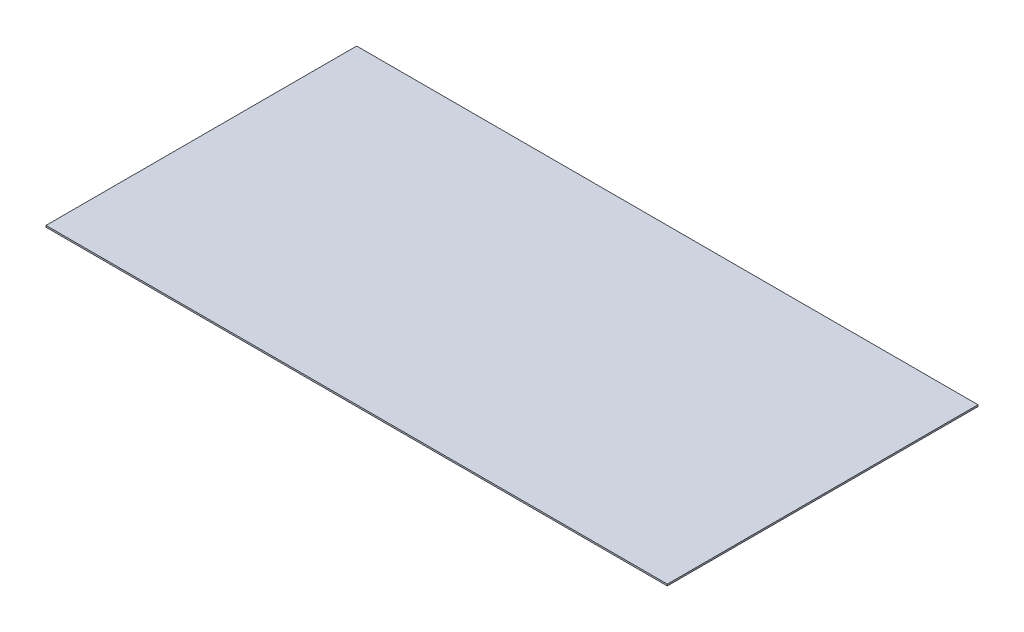
ISO-10303-21;
HEADER;
FILE_DESCRIPTION(('STEP AP214'),'2;1');
FILE_NAME('part.step','',(''),(''),'','','');
FILE_SCHEMA(('AUTOMOTIVE_DESIGN { 1 0 10303 214 1 1 1 1 }'));
ENDSEC;
DATA;
#1=APPLICATION_CONTEXT('core data for automotive mechanical design processes');
#2=APPLICATION_PROTOCOL_DEFINITION('international standard','automotive_design',2000,#1);
#3=PRODUCT_CONTEXT('',#1,'mechanical');
#4=PRODUCT('Part','Part','',(#3));
#5=PRODUCT_RELATED_PRODUCT_CATEGORY('part','',(#4));
#6=PRODUCT_DEFINITION_FORMATION('','',#4);
#7=PRODUCT_DEFINITION_CONTEXT('part definition',#1,'design');
#8=PRODUCT_DEFINITION('design','',#6,#7);
#9=PRODUCT_DEFINITION_SHAPE('','',#8);
#10=(LENGTH_UNIT() NAMED_UNIT(*) SI_UNIT(.MILLI.,.METRE.));
#11=(NAMED_UNIT(*) PLANE_ANGLE_UNIT() SI_UNIT($,.RADIAN.));
#12=(NAMED_UNIT(*) SI_UNIT($,.STERADIAN.) SOLID_ANGLE_UNIT());
#13=UNCERTAINTY_MEASURE_WITH_UNIT(LENGTH_MEASURE(1.E-05),#10,'distance_accuracy_value','');
#14=(GEOMETRIC_REPRESENTATION_CONTEXT(3) GLOBAL_UNCERTAINTY_ASSIGNED_CONTEXT((#13)) GLOBAL_UNIT_ASSIGNED_CONTEXT((#10,
#11,#12)) REPRESENTATION_CONTEXT('',''));
#15=CARTESIAN_POINT('',(0.,0.,0.));
#16=DIRECTION('',(0.,0.,1.));
#17=DIRECTION('',(1.,0.,0.));
#18=AXIS2_PLACEMENT_3D('',#15,#16,#17);
#19=CARTESIAN_POINT('',(609.6,3.175,304.8));
#20=DIRECTION('',(-1.,0.,0.));
#21=DIRECTION('',(0.,0.,1.));
#22=AXIS2_PLACEMENT_3D('',#19,#20,#21);
#23=PLANE('',#22);
#24=DIRECTION('',(0.,0.,-1.));
#25=VECTOR('',#24,1.);
#26=CARTESIAN_POINT('',(609.6,0.,304.8));
#27=LINE('',#26,#25);
#28=CARTESIAN_POINT('',(609.6,0.,304.8));
#29=VERTEX_POINT('',#28);
#30=CARTESIAN_POINT('',(609.6,0.,-304.8));
#31=VERTEX_POINT('',#30);
#32=EDGE_CURVE('E107',#29,#31,#27,.T.);
#33=ORIENTED_EDGE('',*,*,#32,.T.);
#34=DIRECTION('',(0.,-1.,0.));
#35=VECTOR('',#34,1.);
#36=CARTESIAN_POINT('',(609.6,3.175,-304.8));
#37=LINE('',#36,#35);
#38=CARTESIAN_POINT('',(609.6,3.175,-304.8));
#39=VERTEX_POINT('',#38);
#40=EDGE_CURVE('E11',#39,#31,#37,.T.);
#41=ORIENTED_EDGE('',*,*,#40,.F.);
#42=DIRECTION('',(0.,0.,-1.));
#43=VECTOR('',#42,1.);
#44=CARTESIAN_POINT('',(609.6,3.175,304.8));
#45=LINE('',#44,#43);
#46=CARTESIAN_POINT('',(609.6,3.175,304.8));
#47=VERTEX_POINT('',#46);
#48=EDGE_CURVE('E91',#47,#39,#45,.T.);
#49=ORIENTED_EDGE('',*,*,#48,.F.);
#50=DIRECTION('',(0.,-1.,0.));
#51=VECTOR('',#50,1.);
#52=CARTESIAN_POINT('',(609.6,3.175,304.8));
#53=LINE('',#52,#51);
#54=EDGE_CURVE('E103',#47,#29,#53,.T.);
#55=ORIENTED_EDGE('',*,*,#54,.T.);
#56=EDGE_LOOP('',(#33,#41,#49,#55));
#57=FACE_BOUND('',#56,.T.);
#58=ADVANCED_FACE('F39',(#57),#23,.F.);
#59=CARTESIAN_POINT('',(-609.6,3.175,-304.8));
#60=DIRECTION('',(0.,0.,1.));
#61=DIRECTION('',(1.,0.,0.));
#62=AXIS2_PLACEMENT_3D('',#59,#60,#61);
#63=PLANE('',#62);
#64=DIRECTION('',(-1.,0.,0.));
#65=VECTOR('',#64,1.);
#66=CARTESIAN_POINT('',(-609.6,0.,-304.8));
#67=LINE('',#66,#65);
#68=CARTESIAN_POINT('',(-609.6,0.,-304.8));
#69=VERTEX_POINT('',#68);
#70=EDGE_CURVE('E96',#31,#69,#67,.T.);
#71=ORIENTED_EDGE('',*,*,#70,.T.);
#72=DIRECTION('',(0.,-1.,0.));
#73=VECTOR('',#72,1.);
#74=CARTESIAN_POINT('',(-609.6,3.175,-304.8));
#75=LINE('',#74,#73);
#76=CARTESIAN_POINT('',(-609.6,3.175,-304.8));
#77=VERTEX_POINT('',#76);
#78=EDGE_CURVE('E48',#77,#69,#75,.T.);
#79=ORIENTED_EDGE('',*,*,#78,.F.);
#80=DIRECTION('',(-1.,0.,0.));
#81=VECTOR('',#80,1.);
#82=CARTESIAN_POINT('',(-609.6,3.175,-304.8));
#83=LINE('',#82,#81);
#84=EDGE_CURVE('E86',#39,#77,#83,.T.);
#85=ORIENTED_EDGE('',*,*,#84,.F.);
#86=ORIENTED_EDGE('',*,*,#40,.T.);
#87=EDGE_LOOP('',(#71,#79,#85,#86));
#88=FACE_BOUND('',#87,.T.);
#89=ADVANCED_FACE('F95',(#88),#63,.F.);
#90=CARTESIAN_POINT('',(-609.6,3.175,304.8));
#91=DIRECTION('',(1.,0.,0.));
#92=DIRECTION('',(0.,0.,-1.));
#93=AXIS2_PLACEMENT_3D('',#90,#91,#92);
#94=PLANE('',#93);
#95=DIRECTION('',(0.,0.,1.));
#96=VECTOR('',#95,1.);
#97=CARTESIAN_POINT('',(-609.6,0.,304.8));
#98=LINE('',#97,#96);
#99=CARTESIAN_POINT('',(-609.6,0.,304.8));
#100=VERTEX_POINT('',#99);
#101=EDGE_CURVE('E73',#69,#100,#98,.T.);
#102=ORIENTED_EDGE('',*,*,#101,.T.);
#103=DIRECTION('',(0.,-1.,0.));
#104=VECTOR('',#103,1.);
#105=CARTESIAN_POINT('',(-609.6,3.175,304.8));
#106=LINE('',#105,#104);
#107=CARTESIAN_POINT('',(-609.6,3.175,304.8));
#108=VERTEX_POINT('',#107);
#109=EDGE_CURVE('E98',#108,#100,#106,.T.);
#110=ORIENTED_EDGE('',*,*,#109,.F.);
#111=DIRECTION('',(0.,0.,1.));
#112=VECTOR('',#111,1.);
#113=CARTESIAN_POINT('',(-609.6,3.175,304.8));
#114=LINE('',#113,#112);
#115=EDGE_CURVE('E89',#77,#108,#114,.T.);
#116=ORIENTED_EDGE('',*,*,#115,.F.);
#117=ORIENTED_EDGE('',*,*,#78,.T.);
#118=EDGE_LOOP('',(#102,#110,#116,#117));
#119=FACE_BOUND('',#118,.T.);
#120=ADVANCED_FACE('F99',(#119),#94,.F.);
#121=CARTESIAN_POINT('',(-609.6,3.175,304.8));
#122=DIRECTION('',(0.,0.,-1.));
#123=DIRECTION('',(-1.,0.,0.));
#124=AXIS2_PLACEMENT_3D('',#121,#122,#123);
#125=PLANE('',#124);
#126=DIRECTION('',(1.,0.,0.));
#127=VECTOR('',#126,1.);
#128=CARTESIAN_POINT('',(-609.6,0.,304.8));
#129=LINE('',#128,#127);
#130=EDGE_CURVE('E79',#100,#29,#129,.T.);
#131=ORIENTED_EDGE('',*,*,#130,.T.);
#132=ORIENTED_EDGE('',*,*,#54,.F.);
#133=DIRECTION('',(1.,0.,0.));
#134=VECTOR('',#133,1.);
#135=CARTESIAN_POINT('',(-609.6,3.175,304.8));
#136=LINE('',#135,#134);
#137=EDGE_CURVE('E56',#108,#47,#136,.T.);
#138=ORIENTED_EDGE('',*,*,#137,.F.);
#139=ORIENTED_EDGE('',*,*,#109,.T.);
#140=EDGE_LOOP('',(#131,#132,#138,#139));
#141=FACE_BOUND('',#140,.T.);
#142=ADVANCED_FACE('F120',(#141),#125,.F.);
#143=CARTESIAN_POINT('',(0.,3.175,0.));
#144=DIRECTION('',(0.,-1.,0.));
#145=DIRECTION('',(0.,0.,-1.));
#146=AXIS2_PLACEMENT_3D('',#143,#144,#145);
#147=PLANE('',#146);
#148=ORIENTED_EDGE('',*,*,#48,.T.);
#149=ORIENTED_EDGE('',*,*,#84,.T.);
#150=ORIENTED_EDGE('',*,*,#115,.T.);
#151=ORIENTED_EDGE('',*,*,#137,.T.);
#152=EDGE_LOOP('',(#148,#149,#150,#151));
#153=FACE_BOUND('',#152,.T.);
#154=ADVANCED_FACE('F87',(#153),#147,.F.);
#155=CARTESIAN_POINT('',(0.,0.,0.));
#156=DIRECTION('',(0.,-1.,0.));
#157=DIRECTION('',(0.,0.,-1.));
#158=AXIS2_PLACEMENT_3D('',#155,#156,#157);
#159=PLANE('',#158);
#160=ORIENTED_EDGE('',*,*,#32,.F.);
#161=ORIENTED_EDGE('',*,*,#130,.F.);
#162=ORIENTED_EDGE('',*,*,#101,.F.);
#163=ORIENTED_EDGE('',*,*,#70,.F.);
#164=EDGE_LOOP('',(#160,#161,#162,#163));
#165=FACE_BOUND('',#164,.T.);
#166=ADVANCED_FACE('F123',(#165),#159,.T.);
#167=CLOSED_SHELL('',(#58,#89,#120,#142,#154,#166));
#168=MANIFOLD_SOLID_BREP('B2',#167);
#169=ADVANCED_BREP_SHAPE_REPRESENTATION('',(#18,#168),#14);
#170=SHAPE_DEFINITION_REPRESENTATION(#9,#169);
ENDSEC;
END-ISO-10303-21;
